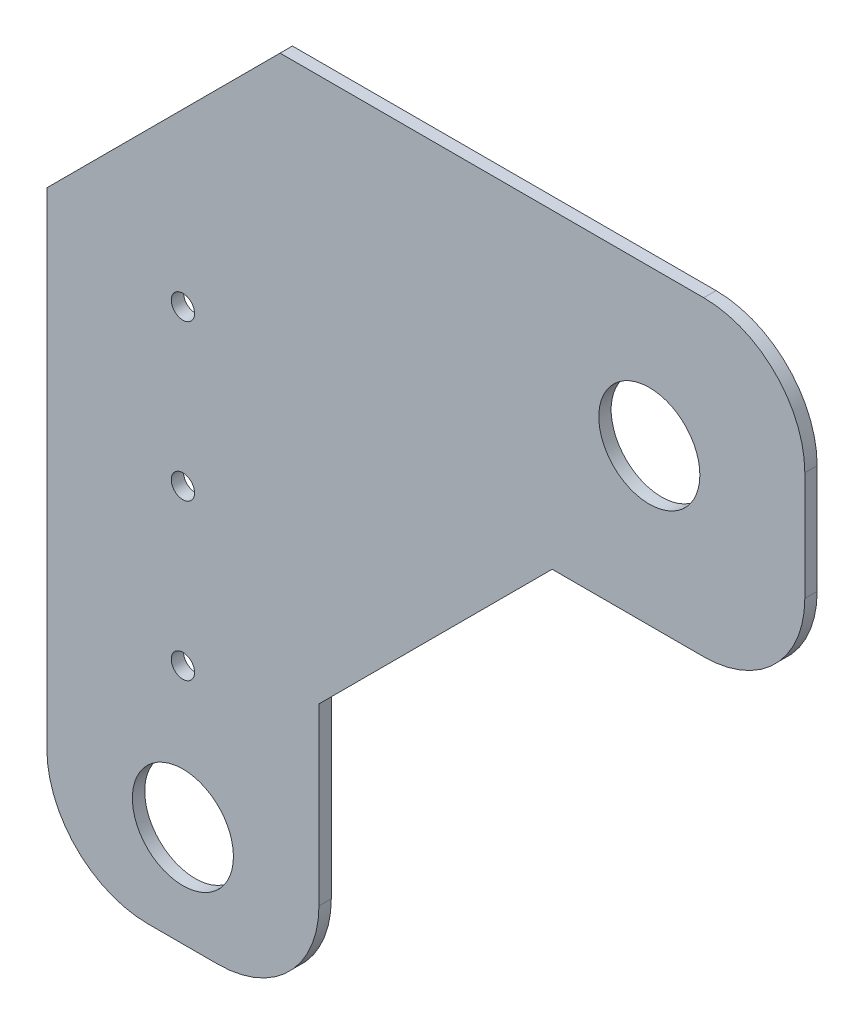
ISO-10303-21;
HEADER;
FILE_DESCRIPTION(('STEP AP214'),'2;1');
FILE_NAME('part.step','',(''),(''),'','','');
FILE_SCHEMA(('AUTOMOTIVE_DESIGN { 1 0 10303 214 1 1 1 1 }'));
ENDSEC;
DATA;
#1=APPLICATION_CONTEXT('core data for automotive mechanical design processes');
#2=APPLICATION_PROTOCOL_DEFINITION('international standard','automotive_design',2000,#1);
#3=PRODUCT_CONTEXT('',#1,'mechanical');
#4=PRODUCT('Part','Part','',(#3));
#5=PRODUCT_RELATED_PRODUCT_CATEGORY('part','',(#4));
#6=PRODUCT_DEFINITION_FORMATION('','',#4);
#7=PRODUCT_DEFINITION_CONTEXT('part definition',#1,'design');
#8=PRODUCT_DEFINITION('design','',#6,#7);
#9=PRODUCT_DEFINITION_SHAPE('','',#8);
#10=(LENGTH_UNIT() NAMED_UNIT(*) SI_UNIT(.MILLI.,.METRE.));
#11=(NAMED_UNIT(*) PLANE_ANGLE_UNIT() SI_UNIT($,.RADIAN.));
#12=(NAMED_UNIT(*) SI_UNIT($,.STERADIAN.) SOLID_ANGLE_UNIT());
#13=UNCERTAINTY_MEASURE_WITH_UNIT(LENGTH_MEASURE(1.E-05),#10,'distance_accuracy_value','');
#14=(GEOMETRIC_REPRESENTATION_CONTEXT(3) GLOBAL_UNCERTAINTY_ASSIGNED_CONTEXT((#13)) GLOBAL_UNIT_ASSIGNED_CONTEXT((#10,
#11,#12)) REPRESENTATION_CONTEXT('',''));
#15=CARTESIAN_POINT('',(0.,0.,0.));
#16=DIRECTION('',(0.,0.,1.));
#17=DIRECTION('',(1.,0.,0.));
#18=AXIS2_PLACEMENT_3D('',#15,#16,#17);
#19=CARTESIAN_POINT('',(0.,0.,1.5875));
#20=DIRECTION('',(0.,0.,1.));
#21=DIRECTION('',(1.,0.,0.));
#22=AXIS2_PLACEMENT_3D('',#19,#20,#21);
#23=PLANE('',#22);
#24=CARTESIAN_POINT('',(17.5,25.,1.5875));
#25=DIRECTION('',(0.,0.,1.));
#26=DIRECTION('',(1.,0.,0.));
#27=AXIS2_PLACEMENT_3D('',#24,#25,#26);
#28=CIRCLE('',#27,1.5);
#29=CARTESIAN_POINT('',(19.,25.,1.5875));
#30=VERTEX_POINT('',#29);
#31=EDGE_CURVE('E461',#30,#30,#28,.T.);
#32=ORIENTED_EDGE('',*,*,#31,.F.);
#33=EDGE_LOOP('',(#32));
#34=FACE_BOUND('',#33,.T.);
#35=CARTESIAN_POINT('',(77.5,59.5,1.5875));
#36=DIRECTION('',(0.,0.,1.));
#37=DIRECTION('',(1.,0.,0.));
#38=AXIS2_PLACEMENT_3D('',#35,#36,#37);
#39=CIRCLE('',#38,6.5);
#40=CARTESIAN_POINT('',(84.,59.5,1.5875));
#41=VERTEX_POINT('',#40);
#42=EDGE_CURVE('E238',#41,#41,#39,.T.);
#43=ORIENTED_EDGE('',*,*,#42,.F.);
#44=EDGE_LOOP('',(#43));
#45=FACE_BOUND('',#44,.T.);
#46=DIRECTION('',(-1.,0.,0.));
#47=VECTOR('',#46,1.);
#48=CARTESIAN_POINT('',(0.,79.5,1.5875));
#49=LINE('',#48,#47);
#50=CARTESIAN_POINT('',(84.5,79.5,1.5875));
#51=VERTEX_POINT('',#50);
#52=CARTESIAN_POINT('',(30.0000000000001,79.5,1.5875));
#53=VERTEX_POINT('',#52);
#54=EDGE_CURVE('E167',#51,#53,#49,.T.);
#55=ORIENTED_EDGE('',*,*,#54,.T.);
#56=DIRECTION('',(0.707106781186549,0.707106781186546,0.));
#57=VECTOR('',#56,1.);
#58=CARTESIAN_POINT('',(-24.75,24.7500000000001,1.5875));
#59=LINE('',#58,#57);
#60=CARTESIAN_POINT('',(0.,49.5,1.5875));
#61=VERTEX_POINT('',#60);
#62=EDGE_CURVE('E204',#53,#61,#59,.F.);
#63=ORIENTED_EDGE('',*,*,#62,.T.);
#64=DIRECTION('',(0.,-1.,0.));
#65=VECTOR('',#64,1.);
#66=CARTESIAN_POINT('',(0.,0.,1.5875));
#67=LINE('',#66,#65);
#68=CARTESIAN_POINT('',(0.,-13.,1.5875));
#69=VERTEX_POINT('',#68);
#70=EDGE_CURVE('E166',#61,#69,#67,.T.);
#71=ORIENTED_EDGE('',*,*,#70,.T.);
#72=CARTESIAN_POINT('',(13.,-13.,1.5875));
#73=DIRECTION('',(0.,0.,1.));
#74=DIRECTION('',(1.,0.,0.));
#75=AXIS2_PLACEMENT_3D('',#72,#73,#74);
#76=CIRCLE('',#75,13.);
#77=CARTESIAN_POINT('',(13.,-26.,1.5875));
#78=VERTEX_POINT('',#77);
#79=EDGE_CURVE('E175',#69,#78,#76,.T.);
#80=ORIENTED_EDGE('',*,*,#79,.T.);
#81=DIRECTION('',(1.,0.,0.));
#82=VECTOR('',#81,1.);
#83=CARTESIAN_POINT('',(0.,-26.,1.5875));
#84=LINE('',#83,#82);
#85=CARTESIAN_POINT('',(22.,-26.,1.5875));
#86=VERTEX_POINT('',#85);
#87=EDGE_CURVE('E221',#78,#86,#84,.T.);
#88=ORIENTED_EDGE('',*,*,#87,.T.);
#89=CARTESIAN_POINT('',(22.,-13.,1.5875));
#90=DIRECTION('',(0.,0.,1.));
#91=DIRECTION('',(1.,0.,0.));
#92=AXIS2_PLACEMENT_3D('',#89,#90,#91);
#93=CIRCLE('',#92,13.);
#94=CARTESIAN_POINT('',(35.,-13.,1.5875));
#95=VERTEX_POINT('',#94);
#96=EDGE_CURVE('E177',#86,#95,#93,.T.);
#97=ORIENTED_EDGE('',*,*,#96,.T.);
#98=DIRECTION('',(0.,1.,0.));
#99=VECTOR('',#98,1.);
#100=CARTESIAN_POINT('',(35.,-26.,1.5875));
#101=LINE('',#100,#99);
#102=CARTESIAN_POINT('',(35.,9.50000000000011,1.5875));
#103=VERTEX_POINT('',#102);
#104=EDGE_CURVE('E218',#95,#103,#101,.T.);
#105=ORIENTED_EDGE('',*,*,#104,.T.);
#106=DIRECTION('',(-0.707106781186551,-0.707106781186544,0.));
#107=VECTOR('',#106,1.);
#108=CARTESIAN_POINT('',(65.0000000000002,39.5,1.5875));
#109=LINE('',#108,#107);
#110=CARTESIAN_POINT('',(65.0000000000002,39.5,1.5875));
#111=VERTEX_POINT('',#110);
#112=EDGE_CURVE('E11',#103,#111,#109,.F.);
#113=ORIENTED_EDGE('',*,*,#112,.T.);
#114=DIRECTION('',(1.,0.,0.));
#115=VECTOR('',#114,1.);
#116=CARTESIAN_POINT('',(97.5,39.5,1.5875));
#117=LINE('',#116,#115);
#118=CARTESIAN_POINT('',(84.5,39.5,1.5875));
#119=VERTEX_POINT('',#118);
#120=EDGE_CURVE('E217',#111,#119,#117,.T.);
#121=ORIENTED_EDGE('',*,*,#120,.T.);
#122=CARTESIAN_POINT('',(84.5,52.5,1.5875));
#123=DIRECTION('',(0.,0.,1.));
#124=DIRECTION('',(1.,0.,0.));
#125=AXIS2_PLACEMENT_3D('',#122,#123,#124);
#126=CIRCLE('',#125,13.);
#127=CARTESIAN_POINT('',(97.5,52.5,1.5875));
#128=VERTEX_POINT('',#127);
#129=EDGE_CURVE('E181',#119,#128,#126,.T.);
#130=ORIENTED_EDGE('',*,*,#129,.T.);
#131=DIRECTION('',(0.,1.,0.));
#132=VECTOR('',#131,1.);
#133=CARTESIAN_POINT('',(97.5,79.5,1.5875));
#134=LINE('',#133,#132);
#135=CARTESIAN_POINT('',(97.5,66.5,1.5875));
#136=VERTEX_POINT('',#135);
#137=EDGE_CURVE('E147',#128,#136,#134,.T.);
#138=ORIENTED_EDGE('',*,*,#137,.T.);
#139=CARTESIAN_POINT('',(84.5,66.5,1.5875));
#140=DIRECTION('',(0.,0.,1.));
#141=DIRECTION('',(1.,0.,0.));
#142=AXIS2_PLACEMENT_3D('',#139,#140,#141);
#143=CIRCLE('',#142,13.);
#144=EDGE_CURVE('E179',#136,#51,#143,.T.);
#145=ORIENTED_EDGE('',*,*,#144,.T.);
#146=EDGE_LOOP('',(#55,#63,#71,#80,#88,#97,#105,#113,#121,#130,#138,#145));
#147=FACE_BOUND('',#146,.T.);
#148=CARTESIAN_POINT('',(17.5,-13.,1.5875));
#149=DIRECTION('',(0.,0.,1.));
#150=DIRECTION('',(1.,0.,0.));
#151=AXIS2_PLACEMENT_3D('',#148,#149,#150);
#152=CIRCLE('',#151,6.50000000000001);
#153=CARTESIAN_POINT('',(24.,-13.,1.5875));
#154=VERTEX_POINT('',#153);
#155=EDGE_CURVE('E228',#154,#154,#152,.T.);
#156=ORIENTED_EDGE('',*,*,#155,.F.);
#157=EDGE_LOOP('',(#156));
#158=FACE_BOUND('',#157,.T.);
#159=CARTESIAN_POINT('',(17.5,45.,1.5875));
#160=DIRECTION('',(0.,0.,1.));
#161=DIRECTION('',(1.,0.,0.));
#162=AXIS2_PLACEMENT_3D('',#159,#160,#161);
#163=CIRCLE('',#162,1.5);
#164=CARTESIAN_POINT('',(19.,45.,1.5875));
#165=VERTEX_POINT('',#164);
#166=EDGE_CURVE('E467',#165,#165,#163,.T.);
#167=ORIENTED_EDGE('',*,*,#166,.F.);
#168=EDGE_LOOP('',(#167));
#169=FACE_BOUND('',#168,.T.);
#170=CARTESIAN_POINT('',(17.5,5.00000000000001,1.5875));
#171=DIRECTION('',(0.,0.,1.));
#172=DIRECTION('',(1.,0.,0.));
#173=AXIS2_PLACEMENT_3D('',#170,#171,#172);
#174=CIRCLE('',#173,1.5);
#175=CARTESIAN_POINT('',(19.,5.00000000000001,1.5875));
#176=VERTEX_POINT('',#175);
#177=EDGE_CURVE('E452',#176,#176,#174,.T.);
#178=ORIENTED_EDGE('',*,*,#177,.F.);
#179=EDGE_LOOP('',(#178));
#180=FACE_BOUND('',#179,.T.);
#181=ADVANCED_FACE('F37',(#34,#45,#147,#158,#169,#180),#23,.T.);
#182=CARTESIAN_POINT('',(0.,0.,0.));
#183=DIRECTION('',(0.,0.,1.));
#184=DIRECTION('',(1.,0.,0.));
#185=AXIS2_PLACEMENT_3D('',#182,#183,#184);
#186=PLANE('',#185);
#187=DIRECTION('',(0.,-1.,0.));
#188=VECTOR('',#187,1.);
#189=CARTESIAN_POINT('',(0.,0.,0.));
#190=LINE('',#189,#188);
#191=CARTESIAN_POINT('',(0.,49.5,0.));
#192=VERTEX_POINT('',#191);
#193=CARTESIAN_POINT('',(0.,-13.,0.));
#194=VERTEX_POINT('',#193);
#195=EDGE_CURVE('E159',#192,#194,#190,.T.);
#196=ORIENTED_EDGE('',*,*,#195,.F.);
#197=DIRECTION('',(-0.707106781186549,-0.707106781186546,0.));
#198=VECTOR('',#197,1.);
#199=CARTESIAN_POINT('',(0.,49.5,0.));
#200=LINE('',#199,#198);
#201=CARTESIAN_POINT('',(30.0000000000001,79.5,0.));
#202=VERTEX_POINT('',#201);
#203=EDGE_CURVE('E200',#192,#202,#200,.F.);
#204=ORIENTED_EDGE('',*,*,#203,.T.);
#205=DIRECTION('',(-1.,0.,0.));
#206=VECTOR('',#205,1.);
#207=CARTESIAN_POINT('',(0.,79.5,0.));
#208=LINE('',#207,#206);
#209=CARTESIAN_POINT('',(84.5,79.5,0.));
#210=VERTEX_POINT('',#209);
#211=EDGE_CURVE('E155',#210,#202,#208,.T.);
#212=ORIENTED_EDGE('',*,*,#211,.F.);
#213=CARTESIAN_POINT('',(84.5,66.5,0.));
#214=DIRECTION('',(0.,0.,1.));
#215=DIRECTION('',(1.,0.,0.));
#216=AXIS2_PLACEMENT_3D('',#213,#214,#215);
#217=CIRCLE('',#216,13.);
#218=CARTESIAN_POINT('',(97.5,66.5,0.));
#219=VERTEX_POINT('',#218);
#220=EDGE_CURVE('E138',#210,#219,#217,.F.);
#221=ORIENTED_EDGE('',*,*,#220,.T.);
#222=DIRECTION('',(0.,1.,0.));
#223=VECTOR('',#222,1.);
#224=CARTESIAN_POINT('',(97.5,79.5,0.));
#225=LINE('',#224,#223);
#226=CARTESIAN_POINT('',(97.5,52.5,0.));
#227=VERTEX_POINT('',#226);
#228=EDGE_CURVE('E144',#227,#219,#225,.T.);
#229=ORIENTED_EDGE('',*,*,#228,.F.);
#230=CARTESIAN_POINT('',(84.5,52.5,0.));
#231=DIRECTION('',(0.,0.,1.));
#232=DIRECTION('',(1.,0.,0.));
#233=AXIS2_PLACEMENT_3D('',#230,#231,#232);
#234=CIRCLE('',#233,13.);
#235=CARTESIAN_POINT('',(84.5,39.5,0.));
#236=VERTEX_POINT('',#235);
#237=EDGE_CURVE('E128',#227,#236,#234,.F.);
#238=ORIENTED_EDGE('',*,*,#237,.T.);
#239=DIRECTION('',(1.,0.,0.));
#240=VECTOR('',#239,1.);
#241=CARTESIAN_POINT('',(97.5,39.5,0.));
#242=LINE('',#241,#240);
#243=CARTESIAN_POINT('',(65.0000000000002,39.5,0.));
#244=VERTEX_POINT('',#243);
#245=EDGE_CURVE('E156',#244,#236,#242,.T.);
#246=ORIENTED_EDGE('',*,*,#245,.F.);
#247=DIRECTION('',(0.707106781186551,0.707106781186544,0.));
#248=VECTOR('',#247,1.);
#249=CARTESIAN_POINT('',(12.7499999999998,-12.7499999999999,0.));
#250=LINE('',#249,#248);
#251=CARTESIAN_POINT('',(35.,9.50000000000012,0.));
#252=VERTEX_POINT('',#251);
#253=EDGE_CURVE('E46',#244,#252,#250,.F.);
#254=ORIENTED_EDGE('',*,*,#253,.T.);
#255=DIRECTION('',(0.,1.,0.));
#256=VECTOR('',#255,1.);
#257=CARTESIAN_POINT('',(35.,39.5,0.));
#258=LINE('',#257,#256);
#259=CARTESIAN_POINT('',(35.,-13.,0.));
#260=VERTEX_POINT('',#259);
#261=EDGE_CURVE('E161',#260,#252,#258,.T.);
#262=ORIENTED_EDGE('',*,*,#261,.F.);
#263=CARTESIAN_POINT('',(22.,-13.,0.));
#264=DIRECTION('',(0.,0.,1.));
#265=DIRECTION('',(1.,0.,0.));
#266=AXIS2_PLACEMENT_3D('',#263,#264,#265);
#267=CIRCLE('',#266,13.);
#268=CARTESIAN_POINT('',(22.,-26.,0.));
#269=VERTEX_POINT('',#268);
#270=EDGE_CURVE('E171',#260,#269,#267,.F.);
#271=ORIENTED_EDGE('',*,*,#270,.T.);
#272=DIRECTION('',(1.,0.,0.));
#273=VECTOR('',#272,1.);
#274=CARTESIAN_POINT('',(0.,-26.,0.));
#275=LINE('',#274,#273);
#276=CARTESIAN_POINT('',(13.,-26.,0.));
#277=VERTEX_POINT('',#276);
#278=EDGE_CURVE('E214',#277,#269,#275,.T.);
#279=ORIENTED_EDGE('',*,*,#278,.F.);
#280=CARTESIAN_POINT('',(13.,-13.,0.));
#281=DIRECTION('',(0.,0.,1.));
#282=DIRECTION('',(1.,0.,0.));
#283=AXIS2_PLACEMENT_3D('',#280,#281,#282);
#284=CIRCLE('',#283,13.);
#285=EDGE_CURVE('E148',#277,#194,#284,.F.);
#286=ORIENTED_EDGE('',*,*,#285,.T.);
#287=EDGE_LOOP('',(#196,#204,#212,#221,#229,#238,#246,#254,#262,#271,#279,#286));
#288=FACE_BOUND('',#287,.T.);
#289=CARTESIAN_POINT('',(17.5,-13.,0.));
#290=DIRECTION('',(0.,0.,1.));
#291=DIRECTION('',(1.,0.,0.));
#292=AXIS2_PLACEMENT_3D('',#289,#290,#291);
#293=CIRCLE('',#292,6.50000000000001);
#294=CARTESIAN_POINT('',(24.,-13.,0.));
#295=VERTEX_POINT('',#294);
#296=EDGE_CURVE('E233',#295,#295,#293,.T.);
#297=ORIENTED_EDGE('',*,*,#296,.T.);
#298=EDGE_LOOP('',(#297));
#299=FACE_BOUND('',#298,.T.);
#300=CARTESIAN_POINT('',(77.5,59.5,0.));
#301=DIRECTION('',(0.,0.,1.));
#302=DIRECTION('',(1.,0.,0.));
#303=AXIS2_PLACEMENT_3D('',#300,#301,#302);
#304=CIRCLE('',#303,6.5);
#305=CARTESIAN_POINT('',(84.,59.5,0.));
#306=VERTEX_POINT('',#305);
#307=EDGE_CURVE('E241',#306,#306,#304,.T.);
#308=ORIENTED_EDGE('',*,*,#307,.T.);
#309=EDGE_LOOP('',(#308));
#310=FACE_BOUND('',#309,.T.);
#311=CARTESIAN_POINT('',(17.5,45.,0.));
#312=DIRECTION('',(0.,0.,1.));
#313=DIRECTION('',(1.,0.,0.));
#314=AXIS2_PLACEMENT_3D('',#311,#312,#313);
#315=CIRCLE('',#314,1.5);
#316=CARTESIAN_POINT('',(19.,45.,0.));
#317=VERTEX_POINT('',#316);
#318=EDGE_CURVE('E464',#317,#317,#315,.T.);
#319=ORIENTED_EDGE('',*,*,#318,.T.);
#320=EDGE_LOOP('',(#319));
#321=FACE_BOUND('',#320,.T.);
#322=CARTESIAN_POINT('',(17.5,25.,0.));
#323=DIRECTION('',(0.,0.,1.));
#324=DIRECTION('',(1.,0.,0.));
#325=AXIS2_PLACEMENT_3D('',#322,#323,#324);
#326=CIRCLE('',#325,1.5);
#327=CARTESIAN_POINT('',(19.,25.,0.));
#328=VERTEX_POINT('',#327);
#329=EDGE_CURVE('E458',#328,#328,#326,.T.);
#330=ORIENTED_EDGE('',*,*,#329,.T.);
#331=EDGE_LOOP('',(#330));
#332=FACE_BOUND('',#331,.T.);
#333=CARTESIAN_POINT('',(17.5,5.00000000000001,0.));
#334=DIRECTION('',(0.,0.,1.));
#335=DIRECTION('',(1.,0.,0.));
#336=AXIS2_PLACEMENT_3D('',#333,#334,#335);
#337=CIRCLE('',#336,1.5);
#338=CARTESIAN_POINT('',(19.,5.00000000000001,0.));
#339=VERTEX_POINT('',#338);
#340=EDGE_CURVE('E455',#339,#339,#337,.T.);
#341=ORIENTED_EDGE('',*,*,#340,.T.);
#342=EDGE_LOOP('',(#341));
#343=FACE_BOUND('',#342,.T.);
#344=ADVANCED_FACE('F152',(#288,#299,#310,#321,#332,#343),#186,.F.);
#345=CARTESIAN_POINT('',(0.,-26.,1.5875));
#346=DIRECTION('',(0.,1.,0.));
#347=DIRECTION('',(0.,0.,1.));
#348=AXIS2_PLACEMENT_3D('',#345,#346,#347);
#349=PLANE('',#348);
#350=ORIENTED_EDGE('',*,*,#278,.T.);
#351=DIRECTION('',(0.,0.,-1.));
#352=VECTOR('',#351,1.);
#353=CARTESIAN_POINT('',(22.,-26.,1.5875));
#354=LINE('',#353,#352);
#355=EDGE_CURVE('E192',#269,#86,#354,.F.);
#356=ORIENTED_EDGE('',*,*,#355,.T.);
#357=ORIENTED_EDGE('',*,*,#87,.F.);
#358=DIRECTION('',(0.,0.,-1.));
#359=VECTOR('',#358,1.);
#360=CARTESIAN_POINT('',(13.,-26.,1.5875));
#361=LINE('',#360,#359);
#362=EDGE_CURVE('E189',#78,#277,#361,.T.);
#363=ORIENTED_EDGE('',*,*,#362,.T.);
#364=EDGE_LOOP('',(#350,#356,#357,#363));
#365=FACE_BOUND('',#364,.T.);
#366=ADVANCED_FACE('F285',(#365),#349,.F.);
#367=CARTESIAN_POINT('',(35.,39.5,1.5875));
#368=DIRECTION('',(-1.,0.,0.));
#369=DIRECTION('',(0.,0.,1.));
#370=AXIS2_PLACEMENT_3D('',#367,#368,#369);
#371=PLANE('',#370);
#372=ORIENTED_EDGE('',*,*,#261,.T.);
#373=DIRECTION('',(0.,0.,1.));
#374=VECTOR('',#373,1.);
#375=CARTESIAN_POINT('',(35.,9.50000000000012,1.5875));
#376=LINE('',#375,#374);
#377=EDGE_CURVE('E53',#252,#103,#376,.T.);
#378=ORIENTED_EDGE('',*,*,#377,.T.);
#379=ORIENTED_EDGE('',*,*,#104,.F.);
#380=DIRECTION('',(0.,0.,-1.));
#381=VECTOR('',#380,1.);
#382=CARTESIAN_POINT('',(35.,-13.,1.5875));
#383=LINE('',#382,#381);
#384=EDGE_CURVE('E186',#95,#260,#383,.T.);
#385=ORIENTED_EDGE('',*,*,#384,.T.);
#386=EDGE_LOOP('',(#372,#378,#379,#385));
#387=FACE_BOUND('',#386,.T.);
#388=ADVANCED_FACE('F212',(#387),#371,.F.);
#389=CARTESIAN_POINT('',(97.5,39.5,1.5875));
#390=DIRECTION('',(0.,1.,0.));
#391=DIRECTION('',(-1.,0.,0.));
#392=AXIS2_PLACEMENT_3D('',#389,#390,#391);
#393=PLANE('',#392);
#394=ORIENTED_EDGE('',*,*,#120,.F.);
#395=DIRECTION('',(0.,0.,-1.));
#396=VECTOR('',#395,1.);
#397=CARTESIAN_POINT('',(65.0000000000002,39.5,0.));
#398=LINE('',#397,#396);
#399=EDGE_CURVE('E206',#111,#244,#398,.T.);
#400=ORIENTED_EDGE('',*,*,#399,.T.);
#401=ORIENTED_EDGE('',*,*,#245,.T.);
#402=DIRECTION('',(0.,0.,-1.));
#403=VECTOR('',#402,1.);
#404=CARTESIAN_POINT('',(84.5,39.5,1.5875));
#405=LINE('',#404,#403);
#406=EDGE_CURVE('E134',#236,#119,#405,.F.);
#407=ORIENTED_EDGE('',*,*,#406,.T.);
#408=EDGE_LOOP('',(#394,#400,#401,#407));
#409=FACE_BOUND('',#408,.T.);
#410=ADVANCED_FACE('F216',(#409),#393,.F.);
#411=CARTESIAN_POINT('',(97.5,79.5,1.5875));
#412=DIRECTION('',(-1.,0.,0.));
#413=DIRECTION('',(0.,0.,1.));
#414=AXIS2_PLACEMENT_3D('',#411,#412,#413);
#415=PLANE('',#414);
#416=ORIENTED_EDGE('',*,*,#137,.F.);
#417=DIRECTION('',(0.,0.,-1.));
#418=VECTOR('',#417,1.);
#419=CARTESIAN_POINT('',(97.5,52.5,1.5875));
#420=LINE('',#419,#418);
#421=EDGE_CURVE('E132',#128,#227,#420,.T.);
#422=ORIENTED_EDGE('',*,*,#421,.T.);
#423=ORIENTED_EDGE('',*,*,#228,.T.);
#424=DIRECTION('',(0.,0.,-1.));
#425=VECTOR('',#424,1.);
#426=CARTESIAN_POINT('',(97.5,66.5,1.5875));
#427=LINE('',#426,#425);
#428=EDGE_CURVE('E149',#219,#136,#427,.F.);
#429=ORIENTED_EDGE('',*,*,#428,.T.);
#430=EDGE_LOOP('',(#416,#422,#423,#429));
#431=FACE_BOUND('',#430,.T.);
#432=ADVANCED_FACE('F143',(#431),#415,.F.);
#433=CARTESIAN_POINT('',(0.,79.5,1.5875));
#434=DIRECTION('',(0.,-1.,0.));
#435=DIRECTION('',(0.,0.,-1.));
#436=AXIS2_PLACEMENT_3D('',#433,#434,#435);
#437=PLANE('',#436);
#438=ORIENTED_EDGE('',*,*,#211,.T.);
#439=DIRECTION('',(0.,0.,1.));
#440=VECTOR('',#439,1.);
#441=CARTESIAN_POINT('',(30.0000000000001,79.5,1.5875));
#442=LINE('',#441,#440);
#443=EDGE_CURVE('E202',#202,#53,#442,.T.);
#444=ORIENTED_EDGE('',*,*,#443,.T.);
#445=ORIENTED_EDGE('',*,*,#54,.F.);
#446=DIRECTION('',(0.,0.,-1.));
#447=VECTOR('',#446,1.);
#448=CARTESIAN_POINT('',(84.5,79.5,1.5875));
#449=LINE('',#448,#447);
#450=EDGE_CURVE('E183',#51,#210,#449,.T.);
#451=ORIENTED_EDGE('',*,*,#450,.T.);
#452=EDGE_LOOP('',(#438,#444,#445,#451));
#453=FACE_BOUND('',#452,.T.);
#454=ADVANCED_FACE('F264',(#453),#437,.F.);
#455=CARTESIAN_POINT('',(0.,0.,1.5875));
#456=DIRECTION('',(1.,0.,0.));
#457=DIRECTION('',(0.,0.,-1.));
#458=AXIS2_PLACEMENT_3D('',#455,#456,#457);
#459=PLANE('',#458);
#460=ORIENTED_EDGE('',*,*,#70,.F.);
#461=DIRECTION('',(0.,0.,-1.));
#462=VECTOR('',#461,1.);
#463=CARTESIAN_POINT('',(0.,49.5,1.5875));
#464=LINE('',#463,#462);
#465=EDGE_CURVE('E197',#61,#192,#464,.T.);
#466=ORIENTED_EDGE('',*,*,#465,.T.);
#467=ORIENTED_EDGE('',*,*,#195,.T.);
#468=DIRECTION('',(0.,0.,-1.));
#469=VECTOR('',#468,1.);
#470=CARTESIAN_POINT('',(0.,-13.,1.5875));
#471=LINE('',#470,#469);
#472=EDGE_CURVE('E194',#194,#69,#471,.F.);
#473=ORIENTED_EDGE('',*,*,#472,.T.);
#474=EDGE_LOOP('',(#460,#466,#467,#473));
#475=FACE_BOUND('',#474,.T.);
#476=ADVANCED_FACE('F257',(#475),#459,.F.);
#477=CARTESIAN_POINT('',(17.5,-13.,1.5875));
#478=DIRECTION('',(0.,0.,-1.));
#479=DIRECTION('',(-1.,0.,0.));
#480=AXIS2_PLACEMENT_3D('',#477,#478,#479);
#481=CYLINDRICAL_SURFACE('',#480,6.50000000000001);
#482=ORIENTED_EDGE('',*,*,#155,.T.);
#483=EDGE_LOOP('',(#482));
#484=FACE_BOUND('',#483,.T.);
#485=ORIENTED_EDGE('',*,*,#296,.F.);
#486=EDGE_LOOP('',(#485));
#487=FACE_BOUND('',#486,.T.);
#488=ADVANCED_FACE('F290',(#484,#487),#481,.F.);
#489=CARTESIAN_POINT('',(77.5,59.5,1.5875));
#490=DIRECTION('',(0.,0.,-1.));
#491=DIRECTION('',(-1.,0.,0.));
#492=AXIS2_PLACEMENT_3D('',#489,#490,#491);
#493=CYLINDRICAL_SURFACE('',#492,6.5);
#494=ORIENTED_EDGE('',*,*,#42,.T.);
#495=EDGE_LOOP('',(#494));
#496=FACE_BOUND('',#495,.T.);
#497=ORIENTED_EDGE('',*,*,#307,.F.);
#498=EDGE_LOOP('',(#497));
#499=FACE_BOUND('',#498,.T.);
#500=ADVANCED_FACE('F338',(#496,#499),#493,.F.);
#501=CARTESIAN_POINT('',(17.5,45.,1.5875));
#502=DIRECTION('',(0.,0.,-1.));
#503=DIRECTION('',(-1.,0.,0.));
#504=AXIS2_PLACEMENT_3D('',#501,#502,#503);
#505=CYLINDRICAL_SURFACE('',#504,1.5);
#506=ORIENTED_EDGE('',*,*,#166,.T.);
#507=EDGE_LOOP('',(#506));
#508=FACE_BOUND('',#507,.T.);
#509=ORIENTED_EDGE('',*,*,#318,.F.);
#510=EDGE_LOOP('',(#509));
#511=FACE_BOUND('',#510,.T.);
#512=ADVANCED_FACE('F344',(#508,#511),#505,.F.);
#513=CARTESIAN_POINT('',(17.5,25.,1.5875));
#514=DIRECTION('',(0.,0.,-1.));
#515=DIRECTION('',(-1.,0.,0.));
#516=AXIS2_PLACEMENT_3D('',#513,#514,#515);
#517=CYLINDRICAL_SURFACE('',#516,1.5);
#518=ORIENTED_EDGE('',*,*,#31,.T.);
#519=EDGE_LOOP('',(#518));
#520=FACE_BOUND('',#519,.T.);
#521=ORIENTED_EDGE('',*,*,#329,.F.);
#522=EDGE_LOOP('',(#521));
#523=FACE_BOUND('',#522,.T.);
#524=ADVANCED_FACE('F351',(#520,#523),#517,.F.);
#525=CARTESIAN_POINT('',(17.5,5.00000000000001,1.5875));
#526=DIRECTION('',(0.,0.,-1.));
#527=DIRECTION('',(-1.,0.,0.));
#528=AXIS2_PLACEMENT_3D('',#525,#526,#527);
#529=CYLINDRICAL_SURFACE('',#528,1.5);
#530=ORIENTED_EDGE('',*,*,#177,.T.);
#531=EDGE_LOOP('',(#530));
#532=FACE_BOUND('',#531,.T.);
#533=ORIENTED_EDGE('',*,*,#340,.F.);
#534=EDGE_LOOP('',(#533));
#535=FACE_BOUND('',#534,.T.);
#536=ADVANCED_FACE('F277',(#532,#535),#529,.F.);
#537=CARTESIAN_POINT('',(84.5,52.5,1.5875));
#538=DIRECTION('',(0.,0.,-1.));
#539=DIRECTION('',(-1.,0.,0.));
#540=AXIS2_PLACEMENT_3D('',#537,#538,#539);
#541=CYLINDRICAL_SURFACE('',#540,13.);
#542=ORIENTED_EDGE('',*,*,#129,.F.);
#543=ORIENTED_EDGE('',*,*,#406,.F.);
#544=ORIENTED_EDGE('',*,*,#237,.F.);
#545=ORIENTED_EDGE('',*,*,#421,.F.);
#546=EDGE_LOOP('',(#542,#543,#544,#545));
#547=FACE_BOUND('',#546,.T.);
#548=ADVANCED_FACE('F131',(#547),#541,.T.);
#549=CARTESIAN_POINT('',(84.5,66.5,1.5875));
#550=DIRECTION('',(0.,0.,-1.));
#551=DIRECTION('',(-1.,0.,0.));
#552=AXIS2_PLACEMENT_3D('',#549,#550,#551);
#553=CYLINDRICAL_SURFACE('',#552,13.);
#554=ORIENTED_EDGE('',*,*,#144,.F.);
#555=ORIENTED_EDGE('',*,*,#428,.F.);
#556=ORIENTED_EDGE('',*,*,#220,.F.);
#557=ORIENTED_EDGE('',*,*,#450,.F.);
#558=EDGE_LOOP('',(#554,#555,#556,#557));
#559=FACE_BOUND('',#558,.T.);
#560=ADVANCED_FACE('F269',(#559),#553,.T.);
#561=CARTESIAN_POINT('',(22.,-13.,1.5875));
#562=DIRECTION('',(0.,0.,-1.));
#563=DIRECTION('',(-1.,0.,0.));
#564=AXIS2_PLACEMENT_3D('',#561,#562,#563);
#565=CYLINDRICAL_SURFACE('',#564,13.);
#566=ORIENTED_EDGE('',*,*,#96,.F.);
#567=ORIENTED_EDGE('',*,*,#355,.F.);
#568=ORIENTED_EDGE('',*,*,#270,.F.);
#569=ORIENTED_EDGE('',*,*,#384,.F.);
#570=EDGE_LOOP('',(#566,#567,#568,#569));
#571=FACE_BOUND('',#570,.T.);
#572=ADVANCED_FACE('F251',(#571),#565,.T.);
#573=CARTESIAN_POINT('',(13.,-13.,1.5875));
#574=DIRECTION('',(0.,0.,-1.));
#575=DIRECTION('',(-1.,0.,0.));
#576=AXIS2_PLACEMENT_3D('',#573,#574,#575);
#577=CYLINDRICAL_SURFACE('',#576,13.);
#578=ORIENTED_EDGE('',*,*,#79,.F.);
#579=ORIENTED_EDGE('',*,*,#472,.F.);
#580=ORIENTED_EDGE('',*,*,#285,.F.);
#581=ORIENTED_EDGE('',*,*,#362,.F.);
#582=EDGE_LOOP('',(#578,#579,#580,#581));
#583=FACE_BOUND('',#582,.T.);
#584=ADVANCED_FACE('F254',(#583),#577,.T.);
#585=CARTESIAN_POINT('',(0.,49.5,1.5875));
#586=DIRECTION('',(0.707106781186546,-0.707106781186549,0.));
#587=DIRECTION('',(0.,0.,-1.));
#588=AXIS2_PLACEMENT_3D('',#585,#586,#587);
#589=PLANE('',#588);
#590=ORIENTED_EDGE('',*,*,#62,.F.);
#591=ORIENTED_EDGE('',*,*,#443,.F.);
#592=ORIENTED_EDGE('',*,*,#203,.F.);
#593=ORIENTED_EDGE('',*,*,#465,.F.);
#594=EDGE_LOOP('',(#590,#591,#592,#593));
#595=FACE_BOUND('',#594,.T.);
#596=ADVANCED_FACE('F261',(#595),#589,.F.);
#597=CARTESIAN_POINT('',(65.0000000000002,39.5,1.5875));
#598=DIRECTION('',(0.707106781186544,-0.707106781186551,0.));
#599=DIRECTION('',(0.,0.,1.));
#600=AXIS2_PLACEMENT_3D('',#597,#598,#599);
#601=PLANE('',#600);
#602=ORIENTED_EDGE('',*,*,#112,.F.);
#603=ORIENTED_EDGE('',*,*,#377,.F.);
#604=ORIENTED_EDGE('',*,*,#253,.F.);
#605=ORIENTED_EDGE('',*,*,#399,.F.);
#606=EDGE_LOOP('',(#602,#603,#604,#605));
#607=FACE_BOUND('',#606,.T.);
#608=ADVANCED_FACE('F40',(#607),#601,.T.);
#609=CLOSED_SHELL('',(#181,#344,#366,#388,#410,#432,#454,#476,#488,#500,#512,#524,#536,#548,
#560,#572,#584,#596,#608));
#610=MANIFOLD_SOLID_BREP('B2',#609);
#611=ADVANCED_BREP_SHAPE_REPRESENTATION('',(#18,#610),#14);
#612=SHAPE_DEFINITION_REPRESENTATION(#9,#611);
ENDSEC;
END-ISO-10303-21;
